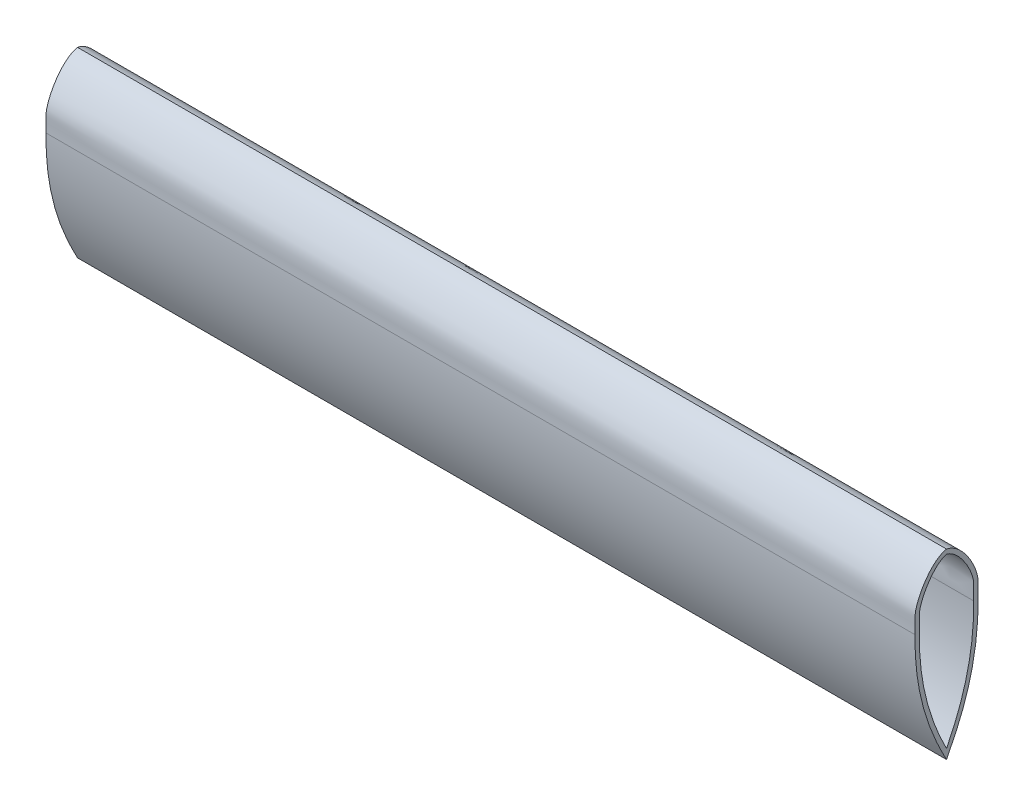
ISO-10303-21;
HEADER;
FILE_DESCRIPTION(('STEP AP214'),'2;1');
FILE_NAME('part.step','',(''),(''),'','','');
FILE_SCHEMA(('AUTOMOTIVE_DESIGN { 1 0 10303 214 1 1 1 1 }'));
ENDSEC;
DATA;
#1=APPLICATION_CONTEXT('core data for automotive mechanical design processes');
#2=APPLICATION_PROTOCOL_DEFINITION('international standard','automotive_design',2000,#1);
#3=PRODUCT_CONTEXT('',#1,'mechanical');
#4=PRODUCT('Part','Part','',(#3));
#5=PRODUCT_RELATED_PRODUCT_CATEGORY('part','',(#4));
#6=PRODUCT_DEFINITION_FORMATION('','',#4);
#7=PRODUCT_DEFINITION_CONTEXT('part definition',#1,'design');
#8=PRODUCT_DEFINITION('design','',#6,#7);
#9=PRODUCT_DEFINITION_SHAPE('','',#8);
#10=(LENGTH_UNIT() NAMED_UNIT(*) SI_UNIT(.MILLI.,.METRE.));
#11=(NAMED_UNIT(*) PLANE_ANGLE_UNIT() SI_UNIT($,.RADIAN.));
#12=(NAMED_UNIT(*) SI_UNIT($,.STERADIAN.) SOLID_ANGLE_UNIT());
#13=UNCERTAINTY_MEASURE_WITH_UNIT(LENGTH_MEASURE(1.E-05),#10,'distance_accuracy_value','');
#14=(GEOMETRIC_REPRESENTATION_CONTEXT(3) GLOBAL_UNCERTAINTY_ASSIGNED_CONTEXT((#13)) GLOBAL_UNIT_ASSIGNED_CONTEXT((#10,
#11,#12)) REPRESENTATION_CONTEXT('',''));
#15=CARTESIAN_POINT('',(0.,0.,0.));
#16=DIRECTION('',(0.,0.,1.));
#17=DIRECTION('',(1.,0.,0.));
#18=AXIS2_PLACEMENT_3D('',#15,#16,#17);
#19=CARTESIAN_POINT('',(-100.380040138055,0.137883897239488,9.20715614920451));
#20=CARTESIAN_POINT('',(-100.380040138055,-3.01606196797375,9.25456787896487));
#21=CARTESIAN_POINT('',(-100.380040138055,-6.16264361898918,9.11059405651138));
#22=CARTESIAN_POINT('',(-100.380040138055,-10.8626435189926,8.56973641400697));
#23=CARTESIAN_POINT('',(-100.380040138055,-12.4197520761779,8.33627501275814));
#24=CARTESIAN_POINT('',(-100.380040138055,-15.5145608051524,7.76137535616037));
#25=CARTESIAN_POINT('',(-100.380040138055,-17.0536244353491,7.41957392528804));
#26=CARTESIAN_POINT('',(-100.380040138055,-21.6326214974826,6.23425482299188));
#27=CARTESIAN_POINT('',(-100.380040138055,-24.6188921134478,5.23448895790813));
#28=CARTESIAN_POINT('',(-100.380040138055,-29.000286622128,3.45107168212761));
#29=CARTESIAN_POINT('',(-100.380040138055,-30.4395127371933,2.81154025811645));
#30=CARTESIAN_POINT('',(-100.380040138055,-32.5691461752788,1.79028170997375));
#31=CARTESIAN_POINT('',(-100.380040138055,-33.2737495180574,1.43867214479025));
#32=CARTESIAN_POINT('',(-100.380040138055,-34.675359425009,0.719336072395417));
#33=CARTESIAN_POINT('',(-100.380040138055,-35.3761643784848,0.359668036198003));
#34=CARTESIAN_POINT('',(-100.380040138055,-36.0769693319606,5.85466819326682E-13));
#35=B_SPLINE_CURVE_WITH_KNOTS('',3,(#19,#20,#21,#22,#23,#24,#25,#26,#27,#28,#29,#30,#31,#32,#33,
#34),.UNSPECIFIED.,.F.,.F.,(4,2,2,2,2,2,2,4),(0.,0.25,0.375,0.5,0.75,0.875,0.9375,1.),.UNSPECIFIED.);
#36=DIRECTION('',(1.,0.,0.));
#37=VECTOR('',#36,1.);
#38=SURFACE_OF_LINEAR_EXTRUSION('',#35,#37);
#39=CARTESIAN_POINT('',(153.619959861945,0.137883897239494,9.20715614920447));
#40=CARTESIAN_POINT('',(153.619959861945,-3.01606196797375,9.25456787896483));
#41=CARTESIAN_POINT('',(153.619959861945,-6.16264361898918,9.11059405651134));
#42=CARTESIAN_POINT('',(153.619959861945,-10.8626435189926,8.56973641400693));
#43=CARTESIAN_POINT('',(153.619959861945,-12.4197520761779,8.3362750127581));
#44=CARTESIAN_POINT('',(153.619959861945,-15.5145608051524,7.76137535616033));
#45=CARTESIAN_POINT('',(153.619959861945,-17.0536244353491,7.41957392528801));
#46=CARTESIAN_POINT('',(153.619959861945,-21.6326214974825,6.23425482299184));
#47=CARTESIAN_POINT('',(153.619959861945,-24.6188921134478,5.23448895790809));
#48=CARTESIAN_POINT('',(153.619959861945,-29.000286622128,3.45107168212757));
#49=CARTESIAN_POINT('',(153.619959861945,-30.4395127371933,2.81154025811641));
#50=CARTESIAN_POINT('',(153.619959861945,-32.5691461752788,1.79028170997371));
#51=CARTESIAN_POINT('',(153.619959861945,-33.2737495180574,1.43867214479021));
#52=CARTESIAN_POINT('',(153.619959861945,-34.675359425009,0.719336072395378));
#53=CARTESIAN_POINT('',(153.619959861945,-35.3761643784848,0.359668036197964));
#54=CARTESIAN_POINT('',(153.619959861945,-36.0769693319606,5.46692280191649E-13));
#55=B_SPLINE_CURVE_WITH_KNOTS('',3,(#39,#40,#41,#42,#43,#44,#45,#46,#47,#48,#49,#50,#51,#52,#53,
#54),.UNSPECIFIED.,.F.,.F.,(4,2,2,2,2,2,2,4),(0.,0.25,0.375,0.5,0.75,0.875,0.9375,1.),.UNSPECIFIED.);
#56=CARTESIAN_POINT('',(153.619959861945,0.137883897239494,9.20715614920447));
#57=VERTEX_POINT('',#56);
#58=CARTESIAN_POINT('',(153.619959861945,-36.0769693319606,5.50525672847727E-13));
#59=VERTEX_POINT('',#58);
#60=EDGE_CURVE('E229',#57,#59,#55,.T.);
#61=ORIENTED_EDGE('',*,*,#60,.F.);
#62=DIRECTION('',(1.,0.,0.));
#63=VECTOR('',#62,1.);
#64=CARTESIAN_POINT('',(-100.380040138055,0.137883897239488,9.20715614920451));
#65=LINE('',#64,#63);
#66=CARTESIAN_POINT('',(-100.380040138055,0.137883897239488,9.20715614920451));
#67=VERTEX_POINT('',#66);
#68=EDGE_CURVE('E13',#67,#57,#65,.T.);
#69=ORIENTED_EDGE('',*,*,#68,.F.);
#70=CARTESIAN_POINT('',(-100.380040138055,-36.0769693319606,5.8930021198276E-13));
#71=VERTEX_POINT('',#70);
#72=EDGE_CURVE('E261',#67,#71,#35,.T.);
#73=ORIENTED_EDGE('',*,*,#72,.T.);
#74=DIRECTION('',(1.,0.,0.));
#75=VECTOR('',#74,1.);
#76=CARTESIAN_POINT('',(-100.380040138055,-36.0769693319606,5.8930021198276E-13));
#77=LINE('',#76,#75);
#78=EDGE_CURVE('E103',#71,#59,#77,.T.);
#79=ORIENTED_EDGE('',*,*,#78,.T.);
#80=EDGE_LOOP('',(#61,#69,#73,#79));
#81=FACE_BOUND('',#80,.T.);
#82=ADVANCED_FACE('F99',(#81),#38,.T.);
#83=CARTESIAN_POINT('',(-100.380040138055,17.2075595458434,-1.16135931544933E-13));
#84=CARTESIAN_POINT('',(-100.380040138055,17.152862003518,0.213797016089821));
#85=CARTESIAN_POINT('',(-100.380040138055,17.1008018026928,0.428807060053311));
#86=CARTESIAN_POINT('',(-100.380040138055,16.968003101158,0.845636752605629));
#87=CARTESIAN_POINT('',(-100.380040138055,16.8906257748625,1.04900235125511));
#88=CARTESIAN_POINT('',(-100.380040138055,16.6301036989386,1.64604130883248));
#89=CARTESIAN_POINT('',(-100.380040138055,16.4187878443371,2.02675755334871));
#90=CARTESIAN_POINT('',(-100.380040138055,16.0576102713675,2.57750067721161));
#91=CARTESIAN_POINT('',(-100.380040138055,15.9292642493959,2.75829823647498));
#92=CARTESIAN_POINT('',(-100.380040138055,15.6629438036593,3.10889431206568));
#93=CARTESIAN_POINT('',(-100.380040138055,15.5247615889203,3.27912106073906));
#94=CARTESIAN_POINT('',(-100.380040138055,15.0972727059457,3.77673202343138));
#95=CARTESIAN_POINT('',(-100.380040138055,14.7951379775308,4.09116225350929));
#96=CARTESIAN_POINT('',(-100.380040138055,14.1639827018088,4.6928729761911));
#97=CARTESIAN_POINT('',(-100.380040138055,13.8349056444013,4.98009640397595));
#98=CARTESIAN_POINT('',(-100.380040138055,13.1540037508977,5.53157218241406));
#99=CARTESIAN_POINT('',(-100.380040138055,12.8012958221803,5.79630297980035));
#100=CARTESIAN_POINT('',(-100.380040138055,11.72685146721,6.54982361859318));
#101=CARTESIAN_POINT('',(-100.380040138055,10.9851579008631,7.00253711647314));
#102=CARTESIAN_POINT('',(-100.380040138055,9.45595006176671,7.8184174396116));
#103=CARTESIAN_POINT('',(-100.380040138055,8.66888333909439,8.18245890481773));
#104=CARTESIAN_POINT('',(-100.380040138055,7.44317737584387,8.64037140527631));
#105=CARTESIAN_POINT('',(-100.380040138055,7.02559682181268,8.77848875807364));
#106=CARTESIAN_POINT('',(-100.380040138055,6.17382792871073,9.00908377803585));
#107=CARTESIAN_POINT('',(-100.380040138055,5.74668263162353,9.10010942656311));
#108=CARTESIAN_POINT('',(-100.380040138055,4.88832003713865,9.20377313957198));
#109=CARTESIAN_POINT('',(-100.380040138055,4.45686279805711,9.21179223365171));
#110=CARTESIAN_POINT('',(-100.380040138055,3.59244839685004,9.19895632193278));
#111=CARTESIAN_POINT('',(-100.380040138055,3.16006289280662,9.1891059557558));
#112=CARTESIAN_POINT('',(-100.380040138055,1.86356590848878,9.1722510232075));
#113=CARTESIAN_POINT('',(-100.380040138055,1.0000174348415,9.17608455259728));
#114=CARTESIAN_POINT('',(-100.380040138055,0.137883897239482,9.20715614920451));
#115=B_SPLINE_CURVE_WITH_KNOTS('',3,(#83,#84,#85,#86,#87,#88,#89,#90,#91,#92,#93,#94,#95,#96,
#97,#98,#99,#100,#101,#102,#103,#104,#105,#106,#107,#108,#109,#110,#111,#112,#113,#114),
.UNSPECIFIED.,.F.,.F.,(4,2,2,2,2,2,2,2,2,2,2,2,2,2,2,4),(0.,0.0312500000000003,
0.0625000000000005,0.125000000000001,0.156250000000001,0.187500000000001,0.250000000000002,
0.312500000000002,0.375000000000002,0.500000000000001,0.625000000000001,0.687500000000001,
0.750000000000001,0.812500000000001,0.875000000000001,1.),.UNSPECIFIED.);
#116=DIRECTION('',(1.,0.,0.));
#117=VECTOR('',#116,1.);
#118=SURFACE_OF_LINEAR_EXTRUSION('',#115,#117);
#119=CARTESIAN_POINT('',(153.619959861945,17.2075595458434,-1.54910470679967E-13));
#120=CARTESIAN_POINT('',(153.619959861945,17.152862003518,0.213797016089782));
#121=CARTESIAN_POINT('',(153.619959861945,17.1008018026928,0.428807060053272));
#122=CARTESIAN_POINT('',(153.619959861945,16.968003101158,0.84563675260559));
#123=CARTESIAN_POINT('',(153.619959861945,16.8906257748625,1.04900235125507));
#124=CARTESIAN_POINT('',(153.619959861945,16.6301036989386,1.64604130883245));
#125=CARTESIAN_POINT('',(153.619959861945,16.4187878443371,2.02675755334867));
#126=CARTESIAN_POINT('',(153.619959861945,16.0576102713675,2.57750067721157));
#127=CARTESIAN_POINT('',(153.619959861945,15.9292642493959,2.75829823647494));
#128=CARTESIAN_POINT('',(153.619959861945,15.6629438036593,3.10889431206564));
#129=CARTESIAN_POINT('',(153.619959861945,15.5247615889203,3.27912106073902));
#130=CARTESIAN_POINT('',(153.619959861945,15.0972727059457,3.77673202343134));
#131=CARTESIAN_POINT('',(153.619959861945,14.7951379775308,4.09116225350925));
#132=CARTESIAN_POINT('',(153.619959861945,14.1639827018088,4.69287297619106));
#133=CARTESIAN_POINT('',(153.619959861945,13.8349056444013,4.98009640397591));
#134=CARTESIAN_POINT('',(153.619959861945,13.1540037508977,5.53157218241402));
#135=CARTESIAN_POINT('',(153.619959861945,12.8012958221803,5.79630297980031));
#136=CARTESIAN_POINT('',(153.619959861945,11.72685146721,6.54982361859315));
#137=CARTESIAN_POINT('',(153.619959861945,10.9851579008631,7.0025371164731));
#138=CARTESIAN_POINT('',(153.619959861945,9.45595006176672,7.81841743961156));
#139=CARTESIAN_POINT('',(153.619959861945,8.6688833390944,8.18245890481769));
#140=CARTESIAN_POINT('',(153.619959861945,7.44317737584388,8.64037140527627));
#141=CARTESIAN_POINT('',(153.619959861945,7.02559682181269,8.7784887580736));
#142=CARTESIAN_POINT('',(153.619959861945,6.17382792871074,9.00908377803582));
#143=CARTESIAN_POINT('',(153.619959861945,5.74668263162353,9.10010942656307));
#144=CARTESIAN_POINT('',(153.619959861945,4.88832003713866,9.20377313957194));
#145=CARTESIAN_POINT('',(153.619959861945,4.45686279805711,9.21179223365168));
#146=CARTESIAN_POINT('',(153.619959861945,3.59244839685005,9.19895632193274));
#147=CARTESIAN_POINT('',(153.619959861945,3.16006289280662,9.18910595575577));
#148=CARTESIAN_POINT('',(153.619959861945,1.86356590848879,9.17225102320747));
#149=CARTESIAN_POINT('',(153.619959861945,1.00001743484151,9.17608455259724));
#150=CARTESIAN_POINT('',(153.619959861945,0.137883897239487,9.20715614920447));
#151=B_SPLINE_CURVE_WITH_KNOTS('',3,(#119,#120,#121,#122,#123,#124,#125,#126,#127,#128,#129,
#130,#131,#132,#133,#134,#135,#136,#137,#138,#139,#140,#141,#142,#143,#144,#145,#146,#147,#148,
#149,#150),.UNSPECIFIED.,.F.,.F.,(4,2,2,2,2,2,2,2,2,2,2,2,2,2,2,4),(0.,0.0312500000000003,
0.0625000000000005,0.125000000000001,0.156250000000001,0.187500000000001,0.250000000000002,
0.312500000000002,0.375000000000002,0.500000000000001,0.625000000000001,0.687500000000001,
0.750000000000001,0.812500000000001,0.875000000000001,1.),.UNSPECIFIED.);
#152=CARTESIAN_POINT('',(153.619959861945,17.2075595458434,-1.54910470679967E-13));
#153=VERTEX_POINT('',#152);
#154=EDGE_CURVE('E254',#153,#57,#151,.T.);
#155=ORIENTED_EDGE('',*,*,#154,.F.);
#156=DIRECTION('',(1.,0.,0.));
#157=VECTOR('',#156,1.);
#158=CARTESIAN_POINT('',(-100.380040138055,17.2075595458434,-1.16135931544933E-13));
#159=LINE('',#158,#157);
#160=CARTESIAN_POINT('',(-100.380040138055,17.2075595458434,-1.16135931544933E-13));
#161=VERTEX_POINT('',#160);
#162=EDGE_CURVE('E108',#161,#153,#159,.T.);
#163=ORIENTED_EDGE('',*,*,#162,.F.);
#164=EDGE_CURVE('E218',#161,#67,#115,.T.);
#165=ORIENTED_EDGE('',*,*,#164,.T.);
#166=ORIENTED_EDGE('',*,*,#68,.T.);
#167=EDGE_LOOP('',(#155,#163,#165,#166));
#168=FACE_BOUND('',#167,.T.);
#169=ADVANCED_FACE('F211',(#168),#118,.T.);
#170=CARTESIAN_POINT('',(-100.380040138055,0.13788389723955,-9.20715614920431));
#171=CARTESIAN_POINT('',(-100.380040138055,1.01097950046926,-9.17568947588759));
#172=CARTESIAN_POINT('',(-100.380040138055,1.88459061875845,-9.17223382694281));
#173=CARTESIAN_POINT('',(-100.380040138055,3.19542448510586,-9.1897187287982));
#174=CARTESIAN_POINT('',(-100.380040138055,3.63245517778549,-9.20022375925239));
#175=CARTESIAN_POINT('',(-100.380040138055,4.50634263954291,-9.21178350797809));
#176=CARTESIAN_POINT('',(-100.380040138055,4.94297606075569,-9.20070239747961));
#177=CARTESIAN_POINT('',(-100.380040138055,5.59667435096606,-9.11606067068693));
#178=CARTESIAN_POINT('',(-100.380040138055,5.81462109422092,-9.0775456326116));
#179=CARTESIAN_POINT('',(-100.380040138055,6.24269846558627,-8.98673912995034));
#180=CARTESIAN_POINT('',(-100.380040138055,6.45396792893944,-8.93429324667074));
#181=CARTESIAN_POINT('',(-100.380040138055,7.08139166700475,-8.76071827502867));
#182=CARTESIAN_POINT('',(-100.380040138055,7.49126650773411,-8.62361945324545));
#183=CARTESIAN_POINT('',(-100.380040138055,8.70308767266459,-8.16704583868328));
#184=CARTESIAN_POINT('',(-100.380040138055,9.48758834313931,-7.80320360130293));
#185=CARTESIAN_POINT('',(-100.380040138055,10.6368344023847,-7.18749020450805));
#186=CARTESIAN_POINT('',(-100.380040138055,11.016052248185,-6.96955373944424));
#187=CARTESIAN_POINT('',(-100.380040138055,11.7571633375627,-6.51357123522543));
#188=CARTESIAN_POINT('',(-100.380040138055,12.1197433055041,-6.27522365782629));
#189=CARTESIAN_POINT('',(-100.380040138055,13.1821062796736,-5.52722885875328));
#190=CARTESIAN_POINT('',(-100.380040138055,13.857489095203,-4.98589787049949));
#191=CARTESIAN_POINT('',(-100.380040138055,14.801700924238,-4.08448323345075));
#192=CARTESIAN_POINT('',(-100.380040138055,15.1060830104655,-3.76712043798505));
#193=CARTESIAN_POINT('',(-100.380040138055,15.6732894052015,-3.10556890090344));
#194=CARTESIAN_POINT('',(-100.380040138055,15.9370992929062,-2.76082512459061));
#195=CARTESIAN_POINT('',(-100.380040138055,16.2944201449862,-2.2166150826339));
#196=CARTESIAN_POINT('',(-100.380040138055,16.4070856093444,-2.03066602099405));
#197=CARTESIAN_POINT('',(-100.380040138055,16.6173432619878,-1.64813078644208));
#198=CARTESIAN_POINT('',(-100.380040138055,16.7153289053561,-1.45061194113059));
#199=CARTESIAN_POINT('',(-100.380040138055,16.8910759065517,-1.04808859285835));
#200=CARTESIAN_POINT('',(-100.380040138055,16.9688185093228,-0.843382437491573));
#201=CARTESIAN_POINT('',(-100.380040138055,17.1015258658926,-0.426225712136222));
#202=CARTESIAN_POINT('',(-100.380040138055,17.153157527226,-0.212641898615518));
#203=CARTESIAN_POINT('',(-100.380040138055,17.2075595458434,-1.16135931544933E-13));
#204=B_SPLINE_CURVE_WITH_KNOTS('',3,(#170,#171,#172,#173,#174,#175,#176,#177,#178,#179,#180,
#181,#182,#183,#184,#185,#186,#187,#188,#189,#190,#191,#192,#193,#194,#195,#196,#197,#198,#199,
#200,#201,#202,#203),.UNSPECIFIED.,.F.,.F.,(4,2,2,2,2,2,2,2,2,2,2,2,2,2,2,2,4),(0.,
0.125000000000001,0.187500000000001,0.250000000000001,0.281250000000001,0.312500000000001,
0.375000000000001,0.500000000000001,0.562500000000001,0.625000000000001,0.750000000000001,
0.812500000000001,0.875,0.90625,0.9375,0.96875,1.),.UNSPECIFIED.);
#205=DIRECTION('',(1.,0.,0.));
#206=VECTOR('',#205,1.);
#207=SURFACE_OF_LINEAR_EXTRUSION('',#204,#206);
#208=CARTESIAN_POINT('',(153.619959861945,0.137883897239556,-9.20715614920434));
#209=CARTESIAN_POINT('',(153.619959861945,1.01097950046926,-9.17568947588763));
#210=CARTESIAN_POINT('',(153.619959861945,1.88459061875845,-9.17223382694285));
#211=CARTESIAN_POINT('',(153.619959861945,3.19542448510587,-9.18971872879824));
#212=CARTESIAN_POINT('',(153.619959861945,3.6324551777855,-9.20022375925243));
#213=CARTESIAN_POINT('',(153.619959861945,4.50634263954291,-9.21178350797813));
#214=CARTESIAN_POINT('',(153.619959861945,4.9429760607557,-9.20070239747965));
#215=CARTESIAN_POINT('',(153.619959861945,5.59667435096606,-9.11606067068697));
#216=CARTESIAN_POINT('',(153.619959861945,5.81462109422092,-9.07754563261163));
#217=CARTESIAN_POINT('',(153.619959861945,6.24269846558628,-8.98673912995038));
#218=CARTESIAN_POINT('',(153.619959861945,6.45396792893945,-8.93429324667078));
#219=CARTESIAN_POINT('',(153.619959861945,7.08139166700476,-8.7607182750287));
#220=CARTESIAN_POINT('',(153.619959861945,7.49126650773412,-8.62361945324548));
#221=CARTESIAN_POINT('',(153.619959861945,8.70308767266459,-8.16704583868332));
#222=CARTESIAN_POINT('',(153.619959861945,9.48758834313931,-7.80320360130297));
#223=CARTESIAN_POINT('',(153.619959861945,10.6368344023847,-7.18749020450808));
#224=CARTESIAN_POINT('',(153.619959861945,11.016052248185,-6.96955373944428));
#225=CARTESIAN_POINT('',(153.619959861945,11.7571633375627,-6.51357123522547));
#226=CARTESIAN_POINT('',(153.619959861945,12.1197433055041,-6.27522365782633));
#227=CARTESIAN_POINT('',(153.619959861945,13.1821062796737,-5.52722885875332));
#228=CARTESIAN_POINT('',(153.619959861945,13.857489095203,-4.98589787049953));
#229=CARTESIAN_POINT('',(153.619959861945,14.801700924238,-4.08448323345079));
#230=CARTESIAN_POINT('',(153.619959861945,15.1060830104656,-3.76712043798508));
#231=CARTESIAN_POINT('',(153.619959861945,15.6732894052015,-3.10556890090348));
#232=CARTESIAN_POINT('',(153.619959861945,15.9370992929062,-2.76082512459065));
#233=CARTESIAN_POINT('',(153.619959861945,16.2944201449862,-2.21661508263394));
#234=CARTESIAN_POINT('',(153.619959861945,16.4070856093444,-2.03066602099409));
#235=CARTESIAN_POINT('',(153.619959861945,16.6173432619878,-1.64813078644212));
#236=CARTESIAN_POINT('',(153.619959861945,16.7153289053561,-1.45061194113063));
#237=CARTESIAN_POINT('',(153.619959861945,16.8910759065517,-1.04808859285839));
#238=CARTESIAN_POINT('',(153.619959861945,16.9688185093228,-0.843382437491612));
#239=CARTESIAN_POINT('',(153.619959861945,17.1015258658926,-0.42622571213626));
#240=CARTESIAN_POINT('',(153.619959861945,17.153157527226,-0.212641898615557));
#241=CARTESIAN_POINT('',(153.619959861945,17.2075595458434,-1.54910470679967E-13));
#242=B_SPLINE_CURVE_WITH_KNOTS('',3,(#208,#209,#210,#211,#212,#213,#214,#215,#216,#217,#218,
#219,#220,#221,#222,#223,#224,#225,#226,#227,#228,#229,#230,#231,#232,#233,#234,#235,#236,#237,
#238,#239,#240,#241),.UNSPECIFIED.,.F.,.F.,(4,2,2,2,2,2,2,2,2,2,2,2,2,2,2,2,4),(0.,
0.125000000000001,0.187500000000001,0.250000000000001,0.281250000000001,0.312500000000001,
0.375000000000001,0.500000000000001,0.562500000000001,0.625000000000001,0.750000000000001,
0.812500000000001,0.875,0.90625,0.9375,0.96875,1.),.UNSPECIFIED.);
#243=CARTESIAN_POINT('',(153.619959861945,0.137883897239556,-9.20715614920434));
#244=VERTEX_POINT('',#243);
#245=EDGE_CURVE('E246',#244,#153,#242,.T.);
#246=ORIENTED_EDGE('',*,*,#245,.F.);
#247=DIRECTION('',(1.,0.,0.));
#248=VECTOR('',#247,1.);
#249=CARTESIAN_POINT('',(-100.380040138055,0.13788389723955,-9.20715614920431));
#250=LINE('',#249,#248);
#251=CARTESIAN_POINT('',(-100.380040138055,0.13788389723955,-9.20715614920431));
#252=VERTEX_POINT('',#251);
#253=EDGE_CURVE('E266',#252,#244,#250,.T.);
#254=ORIENTED_EDGE('',*,*,#253,.F.);
#255=EDGE_CURVE('E224',#252,#161,#204,.T.);
#256=ORIENTED_EDGE('',*,*,#255,.T.);
#257=ORIENTED_EDGE('',*,*,#162,.T.);
#258=EDGE_LOOP('',(#246,#254,#256,#257));
#259=FACE_BOUND('',#258,.T.);
#260=ADVANCED_FACE('F215',(#259),#207,.T.);
#261=CARTESIAN_POINT('',(-100.380040138055,-36.0769693319606,5.8930021198276E-13));
#262=CARTESIAN_POINT('',(-100.380040138055,-35.3760563629066,-0.359723472093377));
#263=CARTESIAN_POINT('',(-100.380040138055,-34.6751433938526,-0.719446944187339));
#264=CARTESIAN_POINT('',(-100.380040138055,-33.2733174557445,-1.43889388837527));
#265=CARTESIAN_POINT('',(-100.380040138055,-32.5685724441238,-1.79056585666953));
#266=CARTESIAN_POINT('',(-100.380040138055,-30.4383845569298,-2.81206322700428));
#267=CARTESIAN_POINT('',(-100.380040138055,-28.9980258392256,-3.45204899547125));
#268=CARTESIAN_POINT('',(-100.380040138055,-26.0769569243323,-4.64093627892345));
#269=CARTESIAN_POINT('',(-100.380040138055,-24.6004101183921,-5.18815568995377));
#270=CARTESIAN_POINT('',(-100.380040138055,-21.6134932528625,-6.18284167851509));
#271=CARTESIAN_POINT('',(-100.380040138055,-20.1017186473143,-6.63065634423913));
#272=CARTESIAN_POINT('',(-100.380040138055,-15.5227754494136,-7.81562489543863));
#273=CARTESIAN_POINT('',(-100.380040138055,-12.426265441413,-8.38992897514501));
#274=CARTESIAN_POINT('',(-100.380040138055,-6.16013436464744,-9.11075462961601));
#275=CARTESIAN_POINT('',(-100.380040138055,-3.01600779191244,-9.25456706456238));
#276=CARTESIAN_POINT('',(-100.380040138055,0.137883897239555,-9.20715614920431));
#277=B_SPLINE_CURVE_WITH_KNOTS('',3,(#261,#262,#263,#264,#265,#266,#267,#268,#269,#270,#271,
#272,#273,#274,#275,#276),.UNSPECIFIED.,.F.,.F.,(4,2,2,2,2,2,2,4),(0.,0.0625,0.125,0.25,0.375,
0.5,0.75,1.),.UNSPECIFIED.);
#278=DIRECTION('',(1.,0.,0.));
#279=VECTOR('',#278,1.);
#280=SURFACE_OF_LINEAR_EXTRUSION('',#277,#279);
#281=CARTESIAN_POINT('',(153.619959861945,-36.0769693319606,5.50525672847727E-13));
#282=CARTESIAN_POINT('',(153.619959861945,-35.3760563629066,-0.359723472093416));
#283=CARTESIAN_POINT('',(153.619959861945,-34.6751433938526,-0.719446944187378));
#284=CARTESIAN_POINT('',(153.619959861945,-33.2733174557445,-1.43889388837531));
#285=CARTESIAN_POINT('',(153.619959861945,-32.5685724441238,-1.79056585666957));
#286=CARTESIAN_POINT('',(153.619959861945,-30.4383845569298,-2.81206322700432));
#287=CARTESIAN_POINT('',(153.619959861945,-28.9980258392256,-3.45204899547129));
#288=CARTESIAN_POINT('',(153.619959861945,-26.0769569243323,-4.64093627892349));
#289=CARTESIAN_POINT('',(153.619959861945,-24.6004101183921,-5.18815568995381));
#290=CARTESIAN_POINT('',(153.619959861945,-21.6134932528625,-6.18284167851512));
#291=CARTESIAN_POINT('',(153.619959861945,-20.1017186473143,-6.63065634423917));
#292=CARTESIAN_POINT('',(153.619959861945,-15.5227754494136,-7.81562489543867));
#293=CARTESIAN_POINT('',(153.619959861945,-12.426265441413,-8.38992897514505));
#294=CARTESIAN_POINT('',(153.619959861945,-6.16013436464743,-9.11075462961604));
#295=CARTESIAN_POINT('',(153.619959861945,-3.01600779191243,-9.25456706456242));
#296=CARTESIAN_POINT('',(153.619959861945,0.13788389723956,-9.20715614920434));
#297=B_SPLINE_CURVE_WITH_KNOTS('',3,(#281,#282,#283,#284,#285,#286,#287,#288,#289,#290,#291,
#292,#293,#294,#295,#296),.UNSPECIFIED.,.F.,.F.,(4,2,2,2,2,2,2,4),(0.,0.0625,0.125,0.25,0.375,
0.5,0.75,1.),.UNSPECIFIED.);
#298=EDGE_CURVE('E237',#59,#244,#297,.T.);
#299=ORIENTED_EDGE('',*,*,#298,.F.);
#300=ORIENTED_EDGE('',*,*,#78,.F.);
#301=EDGE_CURVE('E281',#71,#252,#277,.T.);
#302=ORIENTED_EDGE('',*,*,#301,.T.);
#303=ORIENTED_EDGE('',*,*,#253,.T.);
#304=EDGE_LOOP('',(#299,#300,#302,#303));
#305=FACE_BOUND('',#304,.T.);
#306=ADVANCED_FACE('F207',(#305),#280,.T.);
#307=CARTESIAN_POINT('',(-100.380040138055,-18.5799567893935,7.02446755785599));
#308=DIRECTION('',(-1.,0.,0.));
#309=DIRECTION('',(0.,0.,1.));
#310=AXIS2_PLACEMENT_3D('',#307,#308,#309);
#311=PLANE('',#310);
#312=CARTESIAN_POINT('',(-100.380040138055,0.105464983381301,7.93749999999993));
#313=CARTESIAN_POINT('',(-100.380040138055,-11.8752758390628,8.11760063281919));
#314=CARTESIAN_POINT('',(-100.380040138055,-22.6445933827702,5.46629021684321));
#315=CARTESIAN_POINT('',(-100.380040138055,-33.2955350166187,5.7516492615898E-13));
#316=B_SPLINE_CURVE_WITH_KNOTS('',3,(#312,#313,#314,#315),.UNSPECIFIED.,.F.,.F.,(4,4),(0.,1.),.UNSPECIFIED.);
#317=CARTESIAN_POINT('',(-100.380040138055,0.1054649833813,7.93749999999994));
#318=VERTEX_POINT('',#317);
#319=CARTESIAN_POINT('',(-100.380040138055,-33.2955350166187,5.7516492615898E-13));
#320=VERTEX_POINT('',#319);
#321=EDGE_CURVE('E167',#318,#320,#316,.T.);
#322=ORIENTED_EDGE('',*,*,#321,.T.);
#323=CARTESIAN_POINT('',(-100.380040138055,-33.2955350166187,5.7516492615898E-13));
#324=CARTESIAN_POINT('',(-100.380040138055,-22.6445933827708,-5.46629021684192));
#325=CARTESIAN_POINT('',(-100.380040138055,-11.8752758390628,-8.11760063281907));
#326=CARTESIAN_POINT('',(-100.380040138055,0.105464983381356,-7.93749999999973));
#327=B_SPLINE_CURVE_WITH_KNOTS('',3,(#323,#324,#325,#326),.UNSPECIFIED.,.F.,.F.,(4,4),(0.,1.),.UNSPECIFIED.);
#328=CARTESIAN_POINT('',(-100.380040138055,0.105464983381356,-7.93749999999973));
#329=VERTEX_POINT('',#328);
#330=EDGE_CURVE('E176',#320,#329,#327,.T.);
#331=ORIENTED_EDGE('',*,*,#330,.T.);
#332=CARTESIAN_POINT('',(-100.380040138055,0.105464983381356,-7.93749999999973));
#333=CARTESIAN_POINT('',(-100.380040138055,1.57565461459209,-7.88451384743202));
#334=CARTESIAN_POINT('',(-100.380040138055,3.33473819030077,-7.92593053810744));
#335=CARTESIAN_POINT('',(-100.380040138055,7.54708300187666,-7.98902906903361));
#336=CARTESIAN_POINT('',(-100.380040138055,14.9234073115813,-3.80414762291368));
#337=CARTESIAN_POINT('',(-100.380040138055,15.8966553457297,0.));
#338=B_SPLINE_CURVE_WITH_KNOTS('',3,(#332,#333,#334,#335,#336,#337),.UNSPECIFIED.,.F.,.F.,(4,1,
1,4),(0.,0.236691734828959,0.336691734828958,1.),.UNSPECIFIED.);
#339=CARTESIAN_POINT('',(-100.380040138055,15.8966553457297,-1.59318613867227E-13));
#340=VERTEX_POINT('',#339);
#341=EDGE_CURVE('E116',#329,#340,#338,.T.);
#342=ORIENTED_EDGE('',*,*,#341,.T.);
#343=CARTESIAN_POINT('',(-100.380040138055,15.8966553457297,-1.59318613867227E-13));
#344=CARTESIAN_POINT('',(-100.380040138055,14.9234073115812,3.80414762291343));
#345=CARTESIAN_POINT('',(-100.380040138055,7.54708300187675,7.9890290690338));
#346=CARTESIAN_POINT('',(-100.380040138055,3.33473819030105,7.92593053810751));
#347=CARTESIAN_POINT('',(-100.380040138055,1.57565461459204,7.88451384743224));
#348=CARTESIAN_POINT('',(-100.380040138055,0.1054649833813,7.93749999999994));
#349=B_SPLINE_CURVE_WITH_KNOTS('',3,(#343,#344,#345,#346,#347,#348),.UNSPECIFIED.,.F.,.F.,(4,1,
1,4),(0.,0.663308265171042,0.763308265171041,1.),.UNSPECIFIED.);
#350=EDGE_CURVE('E173',#340,#318,#349,.T.);
#351=ORIENTED_EDGE('',*,*,#350,.T.);
#352=EDGE_LOOP('',(#322,#331,#342,#351));
#353=FACE_BOUND('',#352,.T.);
#354=ORIENTED_EDGE('',*,*,#72,.F.);
#355=ORIENTED_EDGE('',*,*,#164,.F.);
#356=ORIENTED_EDGE('',*,*,#255,.F.);
#357=ORIENTED_EDGE('',*,*,#301,.F.);
#358=EDGE_LOOP('',(#354,#355,#356,#357));
#359=FACE_BOUND('',#358,.T.);
#360=ADVANCED_FACE('F180',(#353,#359),#311,.T.);
#361=CARTESIAN_POINT('',(153.619959861945,-18.5799567893935,7.02446755785595));
#362=DIRECTION('',(-1.,0.,0.));
#363=DIRECTION('',(0.,0.,1.));
#364=AXIS2_PLACEMENT_3D('',#361,#362,#363);
#365=PLANE('',#364);
#366=CARTESIAN_POINT('',(153.619959861945,-33.2955350166187,5.36390387023947E-13));
#367=CARTESIAN_POINT('',(153.619959861945,-22.6445933827707,-5.46629021684196));
#368=CARTESIAN_POINT('',(153.619959861945,-11.8752758390628,-8.11760063281911));
#369=CARTESIAN_POINT('',(153.619959861945,0.105464983381362,-7.93749999999977));
#370=B_SPLINE_CURVE_WITH_KNOTS('',3,(#366,#367,#368,#369),.UNSPECIFIED.,.F.,.F.,(4,4),(0.,1.),.UNSPECIFIED.);
#371=CARTESIAN_POINT('',(153.619959861945,-33.2955350166187,5.36390387023947E-13));
#372=VERTEX_POINT('',#371);
#373=CARTESIAN_POINT('',(153.619959861945,0.105464983381362,-7.93749999999977));
#374=VERTEX_POINT('',#373);
#375=EDGE_CURVE('E379',#372,#374,#370,.T.);
#376=ORIENTED_EDGE('',*,*,#375,.F.);
#377=CARTESIAN_POINT('',(153.619959861945,0.105464983381306,7.9374999999999));
#378=CARTESIAN_POINT('',(153.619959861945,-11.8752758390628,8.11760063281915));
#379=CARTESIAN_POINT('',(153.619959861945,-22.6445933827702,5.46629021684317));
#380=CARTESIAN_POINT('',(153.619959861945,-33.2955350166187,5.36390387023947E-13));
#381=B_SPLINE_CURVE_WITH_KNOTS('',3,(#377,#378,#379,#380),.UNSPECIFIED.,.F.,.F.,(4,4),(0.,1.),.UNSPECIFIED.);
#382=CARTESIAN_POINT('',(153.619959861945,0.105464983381306,7.9374999999999));
#383=VERTEX_POINT('',#382);
#384=EDGE_CURVE('E124',#383,#372,#381,.T.);
#385=ORIENTED_EDGE('',*,*,#384,.F.);
#386=CARTESIAN_POINT('',(153.619959861945,15.8966553457297,-1.98093153002261E-13));
#387=CARTESIAN_POINT('',(153.619959861945,14.9234073115812,3.80414762291339));
#388=CARTESIAN_POINT('',(153.619959861945,7.54708300187675,7.98902906903377));
#389=CARTESIAN_POINT('',(153.619959861945,3.33473819030106,7.92593053810747));
#390=CARTESIAN_POINT('',(153.619959861945,1.57565461459204,7.8845138474322));
#391=CARTESIAN_POINT('',(153.619959861945,0.105464983381306,7.9374999999999));
#392=B_SPLINE_CURVE_WITH_KNOTS('',3,(#386,#387,#388,#389,#390,#391),.UNSPECIFIED.,.F.,.F.,(4,1,
1,4),(0.,0.663308265171042,0.763308265171041,1.),.UNSPECIFIED.);
#393=CARTESIAN_POINT('',(153.619959861945,15.8966553457297,-1.98093153002261E-13));
#394=VERTEX_POINT('',#393);
#395=EDGE_CURVE('E183',#394,#383,#392,.T.);
#396=ORIENTED_EDGE('',*,*,#395,.F.);
#397=CARTESIAN_POINT('',(153.619959861945,0.105464983381362,-7.93749999999977));
#398=CARTESIAN_POINT('',(153.619959861945,1.5756546145921,-7.88451384743206));
#399=CARTESIAN_POINT('',(153.619959861945,3.33473819030078,-7.92593053810748));
#400=CARTESIAN_POINT('',(153.619959861945,7.54708300187667,-7.98902906903365));
#401=CARTESIAN_POINT('',(153.619959861945,14.9234073115813,-3.80414762291372));
#402=CARTESIAN_POINT('',(153.619959861945,15.8966553457297,-1.12996157734982E-13));
#403=B_SPLINE_CURVE_WITH_KNOTS('',3,(#397,#398,#399,#400,#401,#402),.UNSPECIFIED.,.F.,.F.,(4,1,
1,4),(0.,0.236691734828959,0.336691734828958,1.),.UNSPECIFIED.);
#404=EDGE_CURVE('E186',#374,#394,#403,.T.);
#405=ORIENTED_EDGE('',*,*,#404,.F.);
#406=EDGE_LOOP('',(#376,#385,#396,#405));
#407=FACE_BOUND('',#406,.T.);
#408=ORIENTED_EDGE('',*,*,#60,.T.);
#409=ORIENTED_EDGE('',*,*,#298,.T.);
#410=ORIENTED_EDGE('',*,*,#245,.T.);
#411=ORIENTED_EDGE('',*,*,#154,.T.);
#412=EDGE_LOOP('',(#408,#409,#410,#411));
#413=FACE_BOUND('',#412,.T.);
#414=ADVANCED_FACE('F203',(#407,#413),#365,.F.);
#415=DIRECTION('',(1.,0.,0.));
#416=VECTOR('',#415,1.);
#417=SURFACE_OF_LINEAR_EXTRUSION('',#316,#416);
#418=ORIENTED_EDGE('',*,*,#384,.T.);
#419=DIRECTION('',(1.,0.,0.));
#420=VECTOR('',#419,1.);
#421=CARTESIAN_POINT('',(-100.380040138055,-33.2955350166187,5.7516492615898E-13));
#422=LINE('',#421,#420);
#423=EDGE_CURVE('E163',#320,#372,#422,.T.);
#424=ORIENTED_EDGE('',*,*,#423,.F.);
#425=ORIENTED_EDGE('',*,*,#321,.F.);
#426=DIRECTION('',(1.,0.,0.));
#427=VECTOR('',#426,1.);
#428=CARTESIAN_POINT('',(-100.380040138055,0.1054649833813,7.93749999999994));
#429=LINE('',#428,#427);
#430=EDGE_CURVE('E238',#318,#383,#429,.T.);
#431=ORIENTED_EDGE('',*,*,#430,.T.);
#432=EDGE_LOOP('',(#418,#424,#425,#431));
#433=FACE_BOUND('',#432,.T.);
#434=ADVANCED_FACE('F165',(#433),#417,.F.);
#435=DIRECTION('',(1.,0.,0.));
#436=VECTOR('',#435,1.);
#437=SURFACE_OF_LINEAR_EXTRUSION('',#349,#436);
#438=ORIENTED_EDGE('',*,*,#395,.T.);
#439=ORIENTED_EDGE('',*,*,#430,.F.);
#440=ORIENTED_EDGE('',*,*,#350,.F.);
#441=DIRECTION('',(1.,0.,0.));
#442=VECTOR('',#441,1.);
#443=CARTESIAN_POINT('',(-100.380040138055,15.8966553457297,-1.59318613867227E-13));
#444=LINE('',#443,#442);
#445=EDGE_CURVE('E401',#340,#394,#444,.T.);
#446=ORIENTED_EDGE('',*,*,#445,.T.);
#447=EDGE_LOOP('',(#438,#439,#440,#446));
#448=FACE_BOUND('',#447,.T.);
#449=ADVANCED_FACE('F202',(#448),#437,.F.);
#450=DIRECTION('',(1.,0.,0.));
#451=VECTOR('',#450,1.);
#452=SURFACE_OF_LINEAR_EXTRUSION('',#338,#451);
#453=ORIENTED_EDGE('',*,*,#404,.T.);
#454=ORIENTED_EDGE('',*,*,#445,.F.);
#455=ORIENTED_EDGE('',*,*,#341,.F.);
#456=DIRECTION('',(1.,0.,0.));
#457=VECTOR('',#456,1.);
#458=CARTESIAN_POINT('',(-100.380040138055,0.105464983381356,-7.93749999999973));
#459=LINE('',#458,#457);
#460=EDGE_CURVE('E172',#329,#374,#459,.T.);
#461=ORIENTED_EDGE('',*,*,#460,.T.);
#462=EDGE_LOOP('',(#453,#454,#455,#461));
#463=FACE_BOUND('',#462,.T.);
#464=ADVANCED_FACE('F342',(#463),#452,.F.);
#465=DIRECTION('',(1.,0.,0.));
#466=VECTOR('',#465,1.);
#467=SURFACE_OF_LINEAR_EXTRUSION('',#327,#466);
#468=ORIENTED_EDGE('',*,*,#375,.T.);
#469=ORIENTED_EDGE('',*,*,#460,.F.);
#470=ORIENTED_EDGE('',*,*,#330,.F.);
#471=ORIENTED_EDGE('',*,*,#423,.T.);
#472=EDGE_LOOP('',(#468,#469,#470,#471));
#473=FACE_BOUND('',#472,.T.);
#474=ADVANCED_FACE('F177',(#473),#467,.F.);
#475=CLOSED_SHELL('',(#82,#169,#260,#306,#360,#414,#434,#449,#464,#474));
#476=MANIFOLD_SOLID_BREP('B2',#475);
#477=ADVANCED_BREP_SHAPE_REPRESENTATION('',(#18,#476),#14);
#478=SHAPE_DEFINITION_REPRESENTATION(#9,#477);
ENDSEC;
END-ISO-10303-21;
